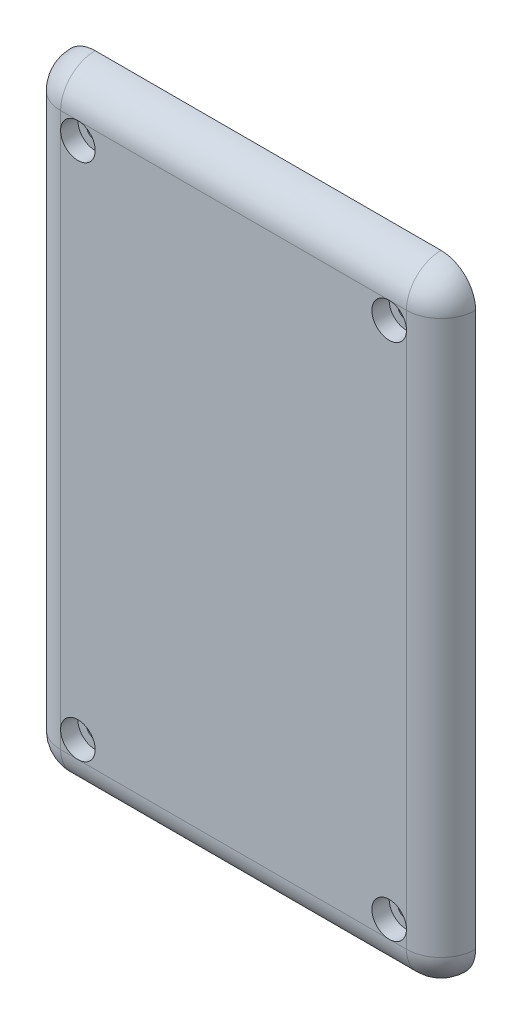
ISO-10303-21;
HEADER;
FILE_DESCRIPTION(('STEP AP214'),'2;1');
FILE_NAME('part.step','',(''),(''),'','','');
FILE_SCHEMA(('AUTOMOTIVE_DESIGN { 1 0 10303 214 1 1 1 1 }'));
ENDSEC;
DATA;
#1=APPLICATION_CONTEXT('core data for automotive mechanical design processes');
#2=APPLICATION_PROTOCOL_DEFINITION('international standard','automotive_design',2000,#1);
#3=PRODUCT_CONTEXT('',#1,'mechanical');
#4=PRODUCT('Part','Part','',(#3));
#5=PRODUCT_RELATED_PRODUCT_CATEGORY('part','',(#4));
#6=PRODUCT_DEFINITION_FORMATION('','',#4);
#7=PRODUCT_DEFINITION_CONTEXT('part definition',#1,'design');
#8=PRODUCT_DEFINITION('design','',#6,#7);
#9=PRODUCT_DEFINITION_SHAPE('','',#8);
#10=(LENGTH_UNIT() NAMED_UNIT(*) SI_UNIT(.MILLI.,.METRE.));
#11=(NAMED_UNIT(*) PLANE_ANGLE_UNIT() SI_UNIT($,.RADIAN.));
#12=(NAMED_UNIT(*) SI_UNIT($,.STERADIAN.) SOLID_ANGLE_UNIT());
#13=UNCERTAINTY_MEASURE_WITH_UNIT(LENGTH_MEASURE(1.E-05),#10,'distance_accuracy_value','');
#14=(GEOMETRIC_REPRESENTATION_CONTEXT(3) GLOBAL_UNCERTAINTY_ASSIGNED_CONTEXT((#13)) GLOBAL_UNIT_ASSIGNED_CONTEXT((#10,
#11,#12)) REPRESENTATION_CONTEXT('',''));
#15=CARTESIAN_POINT('',(0.,0.,0.));
#16=DIRECTION('',(0.,0.,1.));
#17=DIRECTION('',(1.,0.,0.));
#18=AXIS2_PLACEMENT_3D('',#15,#16,#17);
#19=CARTESIAN_POINT('',(0.,0.,2.));
#20=DIRECTION('',(0.,0.,-1.));
#21=DIRECTION('',(-1.,0.,0.));
#22=AXIS2_PLACEMENT_3D('',#19,#20,#21);
#23=PLANE('',#22);
#24=DIRECTION('',(0.,-1.,0.));
#25=VECTOR('',#24,1.);
#26=CARTESIAN_POINT('',(-119.790086771129,0.,2.));
#27=LINE('',#26,#25);
#28=CARTESIAN_POINT('',(-119.790086771129,75.7285838497429,2.));
#29=VERTEX_POINT('',#28);
#30=CARTESIAN_POINT('',(-119.790086771129,74.7285838497429,2.));
#31=VERTEX_POINT('',#30);
#32=EDGE_CURVE('E11',#29,#31,#27,.T.);
#33=ORIENTED_EDGE('',*,*,#32,.T.);
#34=CARTESIAN_POINT('',(-118.790086771129,74.7285838497429,2.));
#35=DIRECTION('',(0.,0.,1.));
#36=DIRECTION('',(1.,0.,0.));
#37=AXIS2_PLACEMENT_3D('',#34,#35,#36);
#38=CIRCLE('',#37,0.999999999999998);
#39=CARTESIAN_POINT('',(-118.790086771129,75.7285838497429,2.));
#40=VERTEX_POINT('',#39);
#41=EDGE_CURVE('E204',#40,#31,#38,.T.);
#42=ORIENTED_EDGE('',*,*,#41,.F.);
#43=DIRECTION('',(-1.,0.,0.));
#44=VECTOR('',#43,1.);
#45=CARTESIAN_POINT('',(0.,75.7285838497429,2.));
#46=LINE('',#45,#44);
#47=EDGE_CURVE('E162',#40,#29,#46,.T.);
#48=ORIENTED_EDGE('',*,*,#47,.T.);
#49=EDGE_LOOP('',(#33,#42,#48));
#50=FACE_BOUND('',#49,.T.);
#51=ADVANCED_FACE('F38',(#50),#23,.F.);
#52=CARTESIAN_POINT('',(-100.790086771129,75.7285838497429,2.));
#53=VERTEX_POINT('',#52);
#54=EDGE_CURVE('E161',#53,#40,#46,.T.);
#55=ORIENTED_EDGE('',*,*,#54,.T.);
#56=EDGE_CURVE('E206',#31,#40,#38,.T.);
#57=ORIENTED_EDGE('',*,*,#56,.F.);
#58=CARTESIAN_POINT('',(-119.790086771129,44.728583849743,2.));
#59=VERTEX_POINT('',#58);
#60=EDGE_CURVE('E47',#31,#59,#27,.T.);
#61=ORIENTED_EDGE('',*,*,#60,.T.);
#62=CARTESIAN_POINT('',(-118.790086771129,44.728583849743,2.));
#63=DIRECTION('',(0.,0.,1.));
#64=DIRECTION('',(1.,0.,0.));
#65=AXIS2_PLACEMENT_3D('',#62,#63,#64);
#66=CIRCLE('',#65,0.999999999999998);
#67=CARTESIAN_POINT('',(-118.790086771129,43.728583849743,2.));
#68=VERTEX_POINT('',#67);
#69=EDGE_CURVE('E120',#68,#59,#66,.T.);
#70=ORIENTED_EDGE('',*,*,#69,.F.);
#71=DIRECTION('',(1.,0.,0.));
#72=VECTOR('',#71,1.);
#73=CARTESIAN_POINT('',(0.,43.728583849743,2.));
#74=LINE('',#73,#72);
#75=CARTESIAN_POINT('',(-100.790086771129,43.728583849743,2.));
#76=VERTEX_POINT('',#75);
#77=EDGE_CURVE('E132',#68,#76,#74,.T.);
#78=ORIENTED_EDGE('',*,*,#77,.T.);
#79=CARTESIAN_POINT('',(-100.790086771129,44.728583849743,2.));
#80=DIRECTION('',(0.,0.,1.));
#81=DIRECTION('',(1.,0.,0.));
#82=AXIS2_PLACEMENT_3D('',#79,#80,#81);
#83=CIRCLE('',#82,0.999999999999998);
#84=CARTESIAN_POINT('',(-99.7900867711287,44.728583849743,2.));
#85=VERTEX_POINT('',#84);
#86=EDGE_CURVE('E211',#85,#76,#83,.T.);
#87=ORIENTED_EDGE('',*,*,#86,.F.);
#88=DIRECTION('',(0.,1.,0.));
#89=VECTOR('',#88,1.);
#90=CARTESIAN_POINT('',(-99.7900867711287,0.,2.));
#91=LINE('',#90,#89);
#92=CARTESIAN_POINT('',(-99.7900867711287,74.7285838497429,2.));
#93=VERTEX_POINT('',#92);
#94=EDGE_CURVE('E151',#85,#93,#91,.T.);
#95=ORIENTED_EDGE('',*,*,#94,.T.);
#96=CARTESIAN_POINT('',(-100.790086771129,74.7285838497429,2.));
#97=DIRECTION('',(0.,0.,1.));
#98=DIRECTION('',(1.,0.,0.));
#99=AXIS2_PLACEMENT_3D('',#96,#97,#98);
#100=CIRCLE('',#99,0.999999999999998);
#101=EDGE_CURVE('E201',#53,#93,#100,.T.);
#102=ORIENTED_EDGE('',*,*,#101,.F.);
#103=EDGE_LOOP('',(#55,#57,#61,#70,#78,#87,#95,#102));
#104=FACE_BOUND('',#103,.T.);
#105=ADVANCED_FACE('F131',(#104),#23,.F.);
#106=CARTESIAN_POINT('',(-99.7900867711287,43.728583849743,2.));
#107=VERTEX_POINT('',#106);
#108=EDGE_CURVE('E148',#107,#85,#91,.T.);
#109=ORIENTED_EDGE('',*,*,#108,.T.);
#110=EDGE_CURVE('E55',#76,#85,#83,.T.);
#111=ORIENTED_EDGE('',*,*,#110,.F.);
#112=EDGE_CURVE('E143',#76,#107,#74,.T.);
#113=ORIENTED_EDGE('',*,*,#112,.T.);
#114=EDGE_LOOP('',(#109,#111,#113));
#115=FACE_BOUND('',#114,.T.);
#116=ADVANCED_FACE('F254',(#115),#23,.F.);
#117=CARTESIAN_POINT('',(-99.7900867711287,75.7285838497429,2.));
#118=VERTEX_POINT('',#117);
#119=EDGE_CURVE('E156',#118,#53,#46,.T.);
#120=ORIENTED_EDGE('',*,*,#119,.T.);
#121=EDGE_CURVE('E62',#93,#53,#100,.T.);
#122=ORIENTED_EDGE('',*,*,#121,.F.);
#123=EDGE_CURVE('E152',#93,#118,#91,.T.);
#124=ORIENTED_EDGE('',*,*,#123,.T.);
#125=EDGE_LOOP('',(#120,#122,#124));
#126=FACE_BOUND('',#125,.T.);
#127=ADVANCED_FACE('F256',(#126),#23,.F.);
#128=CARTESIAN_POINT('',(-119.790086771129,43.728583849743,2.));
#129=VERTEX_POINT('',#128);
#130=EDGE_CURVE('E142',#129,#68,#74,.T.);
#131=ORIENTED_EDGE('',*,*,#130,.T.);
#132=EDGE_CURVE('E117',#59,#68,#66,.T.);
#133=ORIENTED_EDGE('',*,*,#132,.F.);
#134=EDGE_CURVE('E49',#59,#129,#27,.T.);
#135=ORIENTED_EDGE('',*,*,#134,.T.);
#136=EDGE_LOOP('',(#131,#133,#135));
#137=FACE_BOUND('',#136,.T.);
#138=ADVANCED_FACE('F145',(#137),#23,.F.);
#139=CARTESIAN_POINT('',(0.,0.,0.));
#140=DIRECTION('',(0.,0.,-1.));
#141=DIRECTION('',(-1.,0.,0.));
#142=AXIS2_PLACEMENT_3D('',#139,#140,#141);
#143=PLANE('',#142);
#144=CARTESIAN_POINT('',(-118.790086771129,74.7285838497429,0.));
#145=DIRECTION('',(0.,0.,-1.));
#146=DIRECTION('',(-1.,0.,0.));
#147=AXIS2_PLACEMENT_3D('',#144,#145,#146);
#148=CIRCLE('',#147,0.499999999999999);
#149=CARTESIAN_POINT('',(-119.290086771129,74.7285838497429,0.));
#150=VERTEX_POINT('',#149);
#151=EDGE_CURVE('E223',#150,#150,#148,.F.);
#152=ORIENTED_EDGE('',*,*,#151,.T.);
#153=EDGE_LOOP('',(#152));
#154=FACE_BOUND('',#153,.T.);
#155=CARTESIAN_POINT('',(-100.790086771129,74.7285838497429,0.));
#156=DIRECTION('',(0.,0.,-1.));
#157=DIRECTION('',(-1.,0.,0.));
#158=AXIS2_PLACEMENT_3D('',#155,#156,#157);
#159=CIRCLE('',#158,0.499999999999999);
#160=CARTESIAN_POINT('',(-101.290086771129,74.7285838497429,0.));
#161=VERTEX_POINT('',#160);
#162=EDGE_CURVE('E229',#161,#161,#159,.F.);
#163=ORIENTED_EDGE('',*,*,#162,.T.);
#164=EDGE_LOOP('',(#163));
#165=FACE_BOUND('',#164,.T.);
#166=CARTESIAN_POINT('',(-100.790086771129,44.728583849743,0.));
#167=DIRECTION('',(0.,0.,-1.));
#168=DIRECTION('',(-1.,0.,0.));
#169=AXIS2_PLACEMENT_3D('',#166,#167,#168);
#170=CIRCLE('',#169,0.499999999999999);
#171=CARTESIAN_POINT('',(-101.290086771129,44.728583849743,0.));
#172=VERTEX_POINT('',#171);
#173=EDGE_CURVE('E235',#172,#172,#170,.F.);
#174=ORIENTED_EDGE('',*,*,#173,.T.);
#175=EDGE_LOOP('',(#174));
#176=FACE_BOUND('',#175,.T.);
#177=CARTESIAN_POINT('',(-118.790086771129,44.728583849743,0.));
#178=DIRECTION('',(0.,0.,-1.));
#179=DIRECTION('',(-1.,0.,0.));
#180=AXIS2_PLACEMENT_3D('',#177,#178,#179);
#181=CIRCLE('',#180,0.499999999999999);
#182=CARTESIAN_POINT('',(-119.290086771129,44.728583849743,0.));
#183=VERTEX_POINT('',#182);
#184=EDGE_CURVE('E216',#183,#183,#181,.F.);
#185=ORIENTED_EDGE('',*,*,#184,.T.);
#186=EDGE_LOOP('',(#185));
#187=FACE_BOUND('',#186,.T.);
#188=CARTESIAN_POINT('',(-117.950086771129,65.9785838497429,0.));
#189=DIRECTION('',(0.,0.,-1.));
#190=DIRECTION('',(-1.,0.,0.));
#191=AXIS2_PLACEMENT_3D('',#188,#189,#190);
#192=CIRCLE('',#191,2.04999999999999);
#193=CARTESIAN_POINT('',(-120.000086771129,65.9785838497429,0.));
#194=VERTEX_POINT('',#193);
#195=EDGE_CURVE('E192',#194,#194,#192,.T.);
#196=ORIENTED_EDGE('',*,*,#195,.F.);
#197=EDGE_LOOP('',(#196));
#198=FACE_BOUND('',#197,.T.);
#199=DIRECTION('',(0.,-1.,0.));
#200=VECTOR('',#199,1.);
#201=CARTESIAN_POINT('',(-121.790086771129,77.7285838497429,0.));
#202=LINE('',#201,#200);
#203=CARTESIAN_POINT('',(-121.790086771129,75.7285838497429,0.));
#204=VERTEX_POINT('',#203);
#205=CARTESIAN_POINT('',(-121.790086771129,43.728583849743,0.));
#206=VERTEX_POINT('',#205);
#207=EDGE_CURVE('E183',#204,#206,#202,.T.);
#208=ORIENTED_EDGE('',*,*,#207,.F.);
#209=CARTESIAN_POINT('',(-119.790086771129,75.7285838497429,0.));
#210=DIRECTION('',(0.,0.,-1.));
#211=DIRECTION('',(-1.,0.,0.));
#212=AXIS2_PLACEMENT_3D('',#209,#210,#211);
#213=CIRCLE('',#212,2.);
#214=CARTESIAN_POINT('',(-119.790086771129,77.7285838497429,0.));
#215=VERTEX_POINT('',#214);
#216=EDGE_CURVE('E165',#204,#215,#213,.T.);
#217=ORIENTED_EDGE('',*,*,#216,.T.);
#218=DIRECTION('',(-1.,0.,0.));
#219=VECTOR('',#218,1.);
#220=CARTESIAN_POINT('',(-97.7900867711287,77.7285838497429,0.));
#221=LINE('',#220,#219);
#222=CARTESIAN_POINT('',(-99.7900867711287,77.7285838497429,0.));
#223=VERTEX_POINT('',#222);
#224=EDGE_CURVE('E186',#223,#215,#221,.T.);
#225=ORIENTED_EDGE('',*,*,#224,.F.);
#226=CARTESIAN_POINT('',(-99.7900867711287,75.7285838497429,0.));
#227=DIRECTION('',(0.,0.,-1.));
#228=DIRECTION('',(-1.,0.,0.));
#229=AXIS2_PLACEMENT_3D('',#226,#227,#228);
#230=CIRCLE('',#229,2.);
#231=CARTESIAN_POINT('',(-97.7900867711287,75.7285838497429,0.));
#232=VERTEX_POINT('',#231);
#233=EDGE_CURVE('E178',#223,#232,#230,.T.);
#234=ORIENTED_EDGE('',*,*,#233,.T.);
#235=DIRECTION('',(0.,1.,0.));
#236=VECTOR('',#235,1.);
#237=CARTESIAN_POINT('',(-97.7900867711287,77.7285838497429,0.));
#238=LINE('',#237,#236);
#239=CARTESIAN_POINT('',(-97.7900867711287,43.728583849743,0.));
#240=VERTEX_POINT('',#239);
#241=EDGE_CURVE('E189',#240,#232,#238,.T.);
#242=ORIENTED_EDGE('',*,*,#241,.F.);
#243=CARTESIAN_POINT('',(-99.7900867711287,43.728583849743,0.));
#244=DIRECTION('',(0.,0.,-1.));
#245=DIRECTION('',(-1.,0.,0.));
#246=AXIS2_PLACEMENT_3D('',#243,#244,#245);
#247=CIRCLE('',#246,2.);
#248=CARTESIAN_POINT('',(-99.7900867711287,41.7285838497429,0.));
#249=VERTEX_POINT('',#248);
#250=EDGE_CURVE('E174',#240,#249,#247,.T.);
#251=ORIENTED_EDGE('',*,*,#250,.T.);
#252=DIRECTION('',(1.,0.,0.));
#253=VECTOR('',#252,1.);
#254=CARTESIAN_POINT('',(-97.7900867711287,41.7285838497429,0.));
#255=LINE('',#254,#253);
#256=CARTESIAN_POINT('',(-119.790086771129,41.7285838497429,0.));
#257=VERTEX_POINT('',#256);
#258=EDGE_CURVE('E180',#257,#249,#255,.T.);
#259=ORIENTED_EDGE('',*,*,#258,.F.);
#260=CARTESIAN_POINT('',(-119.790086771129,43.728583849743,0.));
#261=DIRECTION('',(0.,0.,-1.));
#262=DIRECTION('',(-1.,0.,0.));
#263=AXIS2_PLACEMENT_3D('',#260,#261,#262);
#264=CIRCLE('',#263,2.);
#265=EDGE_CURVE('E171',#257,#206,#264,.T.);
#266=ORIENTED_EDGE('',*,*,#265,.T.);
#267=EDGE_LOOP('',(#208,#217,#225,#234,#242,#251,#259,#266));
#268=FACE_BOUND('',#267,.T.);
#269=ADVANCED_FACE('F268',(#154,#165,#176,#187,#198,#268),#143,.T.);
#270=CARTESIAN_POINT('',(-99.7900867711287,43.728583849743,0.));
#271=DIRECTION('',(1.,0.,0.));
#272=DIRECTION('',(0.,0.,-1.));
#273=AXIS2_PLACEMENT_3D('',#270,#271,#272);
#274=SPHERICAL_SURFACE('',#273,2.);
#275=CARTESIAN_POINT('',(-99.7900867711287,43.728583849743,0.));
#276=DIRECTION('',(1.,0.,0.));
#277=DIRECTION('',(0.,0.,-1.));
#278=AXIS2_PLACEMENT_3D('',#275,#276,#277);
#279=CIRCLE('',#278,2.);
#280=EDGE_CURVE('E311',#249,#107,#279,.F.);
#281=ORIENTED_EDGE('',*,*,#280,.F.);
#282=ORIENTED_EDGE('',*,*,#250,.F.);
#283=CARTESIAN_POINT('',(-99.7900867711287,43.728583849743,0.));
#284=DIRECTION('',(0.,-1.,0.));
#285=DIRECTION('',(0.,0.,-1.));
#286=AXIS2_PLACEMENT_3D('',#283,#284,#285);
#287=CIRCLE('',#286,2.);
#288=EDGE_CURVE('E42',#107,#240,#287,.F.);
#289=ORIENTED_EDGE('',*,*,#288,.F.);
#290=EDGE_LOOP('',(#281,#282,#289));
#291=FACE_BOUND('',#290,.T.);
#292=ADVANCED_FACE('F40',(#291),#274,.T.);
#293=CARTESIAN_POINT('',(-99.7900867711287,0.,0.));
#294=DIRECTION('',(0.,1.,0.));
#295=DIRECTION('',(-1.,0.,0.));
#296=AXIS2_PLACEMENT_3D('',#293,#294,#295);
#297=CYLINDRICAL_SURFACE('',#296,2.);
#298=ORIENTED_EDGE('',*,*,#288,.T.);
#299=ORIENTED_EDGE('',*,*,#241,.T.);
#300=CARTESIAN_POINT('',(-99.7900867711287,75.7285838497429,0.));
#301=DIRECTION('',(0.,1.,0.));
#302=DIRECTION('',(0.,0.,1.));
#303=AXIS2_PLACEMENT_3D('',#300,#301,#302);
#304=CIRCLE('',#303,2.);
#305=EDGE_CURVE('E312',#118,#232,#304,.T.);
#306=ORIENTED_EDGE('',*,*,#305,.F.);
#307=ORIENTED_EDGE('',*,*,#123,.F.);
#308=ORIENTED_EDGE('',*,*,#94,.F.);
#309=ORIENTED_EDGE('',*,*,#108,.F.);
#310=EDGE_LOOP('',(#298,#299,#306,#307,#308,#309));
#311=FACE_BOUND('',#310,.T.);
#312=ADVANCED_FACE('F276',(#311),#297,.T.);
#313=CARTESIAN_POINT('',(0.,43.728583849743,0.));
#314=DIRECTION('',(1.,0.,0.));
#315=DIRECTION('',(0.,0.,-1.));
#316=AXIS2_PLACEMENT_3D('',#313,#314,#315);
#317=CYLINDRICAL_SURFACE('',#316,2.);
#318=ORIENTED_EDGE('',*,*,#280,.T.);
#319=ORIENTED_EDGE('',*,*,#112,.F.);
#320=ORIENTED_EDGE('',*,*,#77,.F.);
#321=ORIENTED_EDGE('',*,*,#130,.F.);
#322=CARTESIAN_POINT('',(-119.790086771129,43.728583849743,0.));
#323=DIRECTION('',(-1.,0.,0.));
#324=DIRECTION('',(0.,0.,1.));
#325=AXIS2_PLACEMENT_3D('',#322,#323,#324);
#326=CIRCLE('',#325,2.);
#327=EDGE_CURVE('E313',#257,#129,#326,.T.);
#328=ORIENTED_EDGE('',*,*,#327,.F.);
#329=ORIENTED_EDGE('',*,*,#258,.T.);
#330=EDGE_LOOP('',(#318,#319,#320,#321,#328,#329));
#331=FACE_BOUND('',#330,.T.);
#332=ADVANCED_FACE('F140',(#331),#317,.T.);
#333=CARTESIAN_POINT('',(-99.7900867711287,75.7285838497429,0.));
#334=DIRECTION('',(1.,0.,0.));
#335=DIRECTION('',(0.,0.,-1.));
#336=AXIS2_PLACEMENT_3D('',#333,#334,#335);
#337=SPHERICAL_SURFACE('',#336,2.);
#338=ORIENTED_EDGE('',*,*,#305,.T.);
#339=ORIENTED_EDGE('',*,*,#233,.F.);
#340=CARTESIAN_POINT('',(-99.7900867711287,75.7285838497429,0.));
#341=DIRECTION('',(1.,0.,0.));
#342=DIRECTION('',(0.,0.,-1.));
#343=AXIS2_PLACEMENT_3D('',#340,#341,#342);
#344=CIRCLE('',#343,2.);
#345=EDGE_CURVE('E318',#118,#223,#344,.F.);
#346=ORIENTED_EDGE('',*,*,#345,.F.);
#347=EDGE_LOOP('',(#338,#339,#346));
#348=FACE_BOUND('',#347,.T.);
#349=ADVANCED_FACE('F296',(#348),#337,.T.);
#350=CARTESIAN_POINT('',(-119.790086771129,43.728583849743,0.));
#351=DIRECTION('',(0.,-1.,0.));
#352=DIRECTION('',(0.,0.,-1.));
#353=AXIS2_PLACEMENT_3D('',#350,#351,#352);
#354=SPHERICAL_SURFACE('',#353,2.);
#355=ORIENTED_EDGE('',*,*,#265,.F.);
#356=ORIENTED_EDGE('',*,*,#327,.T.);
#357=CARTESIAN_POINT('',(-119.790086771129,43.728583849743,0.));
#358=DIRECTION('',(0.,-1.,0.));
#359=DIRECTION('',(0.,0.,-1.));
#360=AXIS2_PLACEMENT_3D('',#357,#358,#359);
#361=CIRCLE('',#360,2.);
#362=EDGE_CURVE('E321',#206,#129,#361,.F.);
#363=ORIENTED_EDGE('',*,*,#362,.F.);
#364=EDGE_LOOP('',(#355,#356,#363));
#365=FACE_BOUND('',#364,.T.);
#366=ADVANCED_FACE('F292',(#365),#354,.T.);
#367=CARTESIAN_POINT('',(0.,75.7285838497429,0.));
#368=DIRECTION('',(-1.,0.,0.));
#369=DIRECTION('',(0.,0.,1.));
#370=AXIS2_PLACEMENT_3D('',#367,#368,#369);
#371=CYLINDRICAL_SURFACE('',#370,2.);
#372=ORIENTED_EDGE('',*,*,#345,.T.);
#373=ORIENTED_EDGE('',*,*,#224,.T.);
#374=CARTESIAN_POINT('',(-119.790086771129,75.7285838497429,0.));
#375=DIRECTION('',(-1.,0.,0.));
#376=DIRECTION('',(0.,0.,1.));
#377=AXIS2_PLACEMENT_3D('',#374,#375,#376);
#378=CIRCLE('',#377,2.);
#379=EDGE_CURVE('E323',#29,#215,#378,.T.);
#380=ORIENTED_EDGE('',*,*,#379,.F.);
#381=ORIENTED_EDGE('',*,*,#47,.F.);
#382=ORIENTED_EDGE('',*,*,#54,.F.);
#383=ORIENTED_EDGE('',*,*,#119,.F.);
#384=EDGE_LOOP('',(#372,#373,#380,#381,#382,#383));
#385=FACE_BOUND('',#384,.T.);
#386=ADVANCED_FACE('F288',(#385),#371,.T.);
#387=CARTESIAN_POINT('',(-119.790086771129,0.,0.));
#388=DIRECTION('',(0.,-1.,0.));
#389=DIRECTION('',(0.,0.,-1.));
#390=AXIS2_PLACEMENT_3D('',#387,#388,#389);
#391=CYLINDRICAL_SURFACE('',#390,2.);
#392=ORIENTED_EDGE('',*,*,#362,.T.);
#393=ORIENTED_EDGE('',*,*,#134,.F.);
#394=ORIENTED_EDGE('',*,*,#60,.F.);
#395=ORIENTED_EDGE('',*,*,#32,.F.);
#396=CARTESIAN_POINT('',(-119.790086771129,75.7285838497429,0.));
#397=DIRECTION('',(0.,1.,0.));
#398=DIRECTION('',(0.,0.,1.));
#399=AXIS2_PLACEMENT_3D('',#396,#397,#398);
#400=CIRCLE('',#399,2.);
#401=EDGE_CURVE('E199',#204,#29,#400,.T.);
#402=ORIENTED_EDGE('',*,*,#401,.F.);
#403=ORIENTED_EDGE('',*,*,#207,.T.);
#404=EDGE_LOOP('',(#392,#393,#394,#395,#402,#403));
#405=FACE_BOUND('',#404,.T.);
#406=ADVANCED_FACE('F284',(#405),#391,.T.);
#407=CARTESIAN_POINT('',(-119.790086771129,75.7285838497429,0.));
#408=DIRECTION('',(0.,0.,1.));
#409=DIRECTION('',(1.,0.,0.));
#410=AXIS2_PLACEMENT_3D('',#407,#408,#409);
#411=SPHERICAL_SURFACE('',#410,2.);
#412=ORIENTED_EDGE('',*,*,#216,.F.);
#413=ORIENTED_EDGE('',*,*,#401,.T.);
#414=ORIENTED_EDGE('',*,*,#379,.T.);
#415=EDGE_LOOP('',(#412,#413,#414));
#416=FACE_BOUND('',#415,.T.);
#417=ADVANCED_FACE('F280',(#416),#411,.T.);
#418=CARTESIAN_POINT('',(-117.950086771129,65.9785838497429,1.));
#419=DIRECTION('',(0.,0.,-1.));
#420=DIRECTION('',(-1.,0.,0.));
#421=AXIS2_PLACEMENT_3D('',#418,#419,#420);
#422=CYLINDRICAL_SURFACE('',#421,2.04999999999999);
#423=CARTESIAN_POINT('',(-117.950086771129,65.9785838497429,1.));
#424=DIRECTION('',(0.,0.,-1.));
#425=DIRECTION('',(-1.,0.,0.));
#426=AXIS2_PLACEMENT_3D('',#423,#424,#425);
#427=CIRCLE('',#426,2.04999999999999);
#428=CARTESIAN_POINT('',(-120.000086771129,65.9785838497429,1.));
#429=VERTEX_POINT('',#428);
#430=EDGE_CURVE('E195',#429,#429,#427,.T.);
#431=ORIENTED_EDGE('',*,*,#430,.F.);
#432=EDGE_LOOP('',(#431));
#433=FACE_BOUND('',#432,.T.);
#434=ORIENTED_EDGE('',*,*,#195,.T.);
#435=EDGE_LOOP('',(#434));
#436=FACE_BOUND('',#435,.T.);
#437=ADVANCED_FACE('F283',(#433,#436),#422,.F.);
#438=CARTESIAN_POINT('',(-117.950086771129,65.9785838497429,1.));
#439=DIRECTION('',(0.,0.,-1.));
#440=DIRECTION('',(-1.,0.,0.));
#441=AXIS2_PLACEMENT_3D('',#438,#439,#440);
#442=PLANE('',#441);
#443=ORIENTED_EDGE('',*,*,#430,.T.);
#444=EDGE_LOOP('',(#443));
#445=FACE_BOUND('',#444,.T.);
#446=ADVANCED_FACE('F333',(#445),#442,.T.);
#447=CARTESIAN_POINT('',(-100.790086771129,74.7285838497429,1.));
#448=DIRECTION('',(0.,0.,1.));
#449=DIRECTION('',(1.,0.,0.));
#450=AXIS2_PLACEMENT_3D('',#447,#448,#449);
#451=CYLINDRICAL_SURFACE('',#450,0.999999999999998);
#452=CARTESIAN_POINT('',(-100.790086771129,74.7285838497429,1.));
#453=DIRECTION('',(0.,0.,1.));
#454=DIRECTION('',(1.,0.,0.));
#455=AXIS2_PLACEMENT_3D('',#452,#453,#454);
#456=CIRCLE('',#455,0.999999999999998);
#457=CARTESIAN_POINT('',(-99.7900867711287,74.7285838497429,1.));
#458=VERTEX_POINT('',#457);
#459=EDGE_CURVE('E196',#458,#458,#456,.T.);
#460=ORIENTED_EDGE('',*,*,#459,.F.);
#461=EDGE_LOOP('',(#460));
#462=FACE_BOUND('',#461,.T.);
#463=ORIENTED_EDGE('',*,*,#121,.T.);
#464=ORIENTED_EDGE('',*,*,#101,.T.);
#465=EDGE_LOOP('',(#463,#464));
#466=FACE_BOUND('',#465,.T.);
#467=ADVANCED_FACE('F331',(#462,#466),#451,.F.);
#468=CARTESIAN_POINT('',(-100.790086771129,74.7285838497429,1.));
#469=DIRECTION('',(0.,0.,1.));
#470=DIRECTION('',(1.,0.,0.));
#471=AXIS2_PLACEMENT_3D('',#468,#469,#470);
#472=PLANE('',#471);
#473=CARTESIAN_POINT('',(-100.790086771129,74.7285838497429,1.));
#474=DIRECTION('',(0.,0.,1.));
#475=DIRECTION('',(1.,0.,0.));
#476=AXIS2_PLACEMENT_3D('',#473,#474,#475);
#477=CIRCLE('',#476,0.499999999999999);
#478=CARTESIAN_POINT('',(-100.290086771129,74.7285838497429,1.));
#479=VERTEX_POINT('',#478);
#480=EDGE_CURVE('E232',#479,#479,#477,.T.);
#481=ORIENTED_EDGE('',*,*,#480,.F.);
#482=EDGE_LOOP('',(#481));
#483=FACE_BOUND('',#482,.T.);
#484=ORIENTED_EDGE('',*,*,#459,.T.);
#485=EDGE_LOOP('',(#484));
#486=FACE_BOUND('',#485,.T.);
#487=ADVANCED_FACE('F251',(#483,#486),#472,.T.);
#488=CARTESIAN_POINT('',(-100.790086771129,44.728583849743,1.));
#489=DIRECTION('',(0.,0.,1.));
#490=DIRECTION('',(1.,0.,0.));
#491=AXIS2_PLACEMENT_3D('',#488,#489,#490);
#492=CYLINDRICAL_SURFACE('',#491,0.999999999999998);
#493=CARTESIAN_POINT('',(-100.790086771129,44.728583849743,1.));
#494=DIRECTION('',(0.,0.,1.));
#495=DIRECTION('',(1.,0.,0.));
#496=AXIS2_PLACEMENT_3D('',#493,#494,#495);
#497=CIRCLE('',#496,0.999999999999998);
#498=CARTESIAN_POINT('',(-99.7900867711287,44.728583849743,1.));
#499=VERTEX_POINT('',#498);
#500=EDGE_CURVE('E213',#499,#499,#497,.T.);
#501=ORIENTED_EDGE('',*,*,#500,.F.);
#502=EDGE_LOOP('',(#501));
#503=FACE_BOUND('',#502,.T.);
#504=ORIENTED_EDGE('',*,*,#86,.T.);
#505=ORIENTED_EDGE('',*,*,#110,.T.);
#506=EDGE_LOOP('',(#504,#505));
#507=FACE_BOUND('',#506,.T.);
#508=ADVANCED_FACE('F246',(#503,#507),#492,.F.);
#509=CARTESIAN_POINT('',(-100.790086771129,44.728583849743,1.));
#510=DIRECTION('',(0.,0.,1.));
#511=DIRECTION('',(1.,0.,0.));
#512=AXIS2_PLACEMENT_3D('',#509,#510,#511);
#513=PLANE('',#512);
#514=CARTESIAN_POINT('',(-100.790086771129,44.728583849743,1.));
#515=DIRECTION('',(0.,0.,1.));
#516=DIRECTION('',(1.,0.,0.));
#517=AXIS2_PLACEMENT_3D('',#514,#515,#516);
#518=CIRCLE('',#517,0.499999999999999);
#519=CARTESIAN_POINT('',(-100.290086771129,44.728583849743,1.));
#520=VERTEX_POINT('',#519);
#521=EDGE_CURVE('E220',#520,#520,#518,.T.);
#522=ORIENTED_EDGE('',*,*,#521,.F.);
#523=EDGE_LOOP('',(#522));
#524=FACE_BOUND('',#523,.T.);
#525=ORIENTED_EDGE('',*,*,#500,.T.);
#526=EDGE_LOOP('',(#525));
#527=FACE_BOUND('',#526,.T.);
#528=ADVANCED_FACE('F243',(#524,#527),#513,.T.);
#529=CARTESIAN_POINT('',(-118.790086771129,44.728583849743,1.));
#530=DIRECTION('',(0.,0.,1.));
#531=DIRECTION('',(1.,0.,0.));
#532=AXIS2_PLACEMENT_3D('',#529,#530,#531);
#533=CYLINDRICAL_SURFACE('',#532,0.999999999999998);
#534=CARTESIAN_POINT('',(-118.790086771129,44.728583849743,1.));
#535=DIRECTION('',(0.,0.,1.));
#536=DIRECTION('',(1.,0.,0.));
#537=AXIS2_PLACEMENT_3D('',#534,#535,#536);
#538=CIRCLE('',#537,0.999999999999998);
#539=CARTESIAN_POINT('',(-117.790086771129,44.728583849743,1.));
#540=VERTEX_POINT('',#539);
#541=EDGE_CURVE('E124',#540,#540,#538,.T.);
#542=ORIENTED_EDGE('',*,*,#541,.F.);
#543=EDGE_LOOP('',(#542));
#544=FACE_BOUND('',#543,.T.);
#545=ORIENTED_EDGE('',*,*,#132,.T.);
#546=ORIENTED_EDGE('',*,*,#69,.T.);
#547=EDGE_LOOP('',(#545,#546));
#548=FACE_BOUND('',#547,.T.);
#549=ADVANCED_FACE('F119',(#544,#548),#533,.F.);
#550=CARTESIAN_POINT('',(-118.790086771129,44.728583849743,1.));
#551=DIRECTION('',(0.,0.,1.));
#552=DIRECTION('',(1.,0.,0.));
#553=AXIS2_PLACEMENT_3D('',#550,#551,#552);
#554=PLANE('',#553);
#555=CARTESIAN_POINT('',(-118.790086771129,44.728583849743,1.));
#556=DIRECTION('',(0.,0.,1.));
#557=DIRECTION('',(1.,0.,0.));
#558=AXIS2_PLACEMENT_3D('',#555,#556,#557);
#559=CIRCLE('',#558,0.499999999999999);
#560=CARTESIAN_POINT('',(-118.290086771129,44.728583849743,1.));
#561=VERTEX_POINT('',#560);
#562=EDGE_CURVE('E219',#561,#561,#559,.T.);
#563=ORIENTED_EDGE('',*,*,#562,.F.);
#564=EDGE_LOOP('',(#563));
#565=FACE_BOUND('',#564,.T.);
#566=ORIENTED_EDGE('',*,*,#541,.T.);
#567=EDGE_LOOP('',(#566));
#568=FACE_BOUND('',#567,.T.);
#569=ADVANCED_FACE('F432',(#565,#568),#554,.T.);
#570=CARTESIAN_POINT('',(-118.790086771129,74.7285838497429,1.));
#571=DIRECTION('',(0.,0.,1.));
#572=DIRECTION('',(1.,0.,0.));
#573=AXIS2_PLACEMENT_3D('',#570,#571,#572);
#574=CYLINDRICAL_SURFACE('',#573,0.999999999999998);
#575=CARTESIAN_POINT('',(-118.790086771129,74.7285838497429,1.));
#576=DIRECTION('',(0.,0.,1.));
#577=DIRECTION('',(1.,0.,0.));
#578=AXIS2_PLACEMENT_3D('',#575,#576,#577);
#579=CIRCLE('',#578,0.999999999999998);
#580=CARTESIAN_POINT('',(-117.790086771129,74.7285838497429,1.));
#581=VERTEX_POINT('',#580);
#582=EDGE_CURVE('E135',#581,#581,#579,.T.);
#583=ORIENTED_EDGE('',*,*,#582,.F.);
#584=EDGE_LOOP('',(#583));
#585=FACE_BOUND('',#584,.T.);
#586=ORIENTED_EDGE('',*,*,#41,.T.);
#587=ORIENTED_EDGE('',*,*,#56,.T.);
#588=EDGE_LOOP('',(#586,#587));
#589=FACE_BOUND('',#588,.T.);
#590=ADVANCED_FACE('F440',(#585,#589),#574,.F.);
#591=CARTESIAN_POINT('',(-118.790086771129,74.7285838497429,1.));
#592=DIRECTION('',(0.,0.,1.));
#593=DIRECTION('',(1.,0.,0.));
#594=AXIS2_PLACEMENT_3D('',#591,#592,#593);
#595=PLANE('',#594);
#596=CARTESIAN_POINT('',(-118.790086771129,74.7285838497429,1.));
#597=DIRECTION('',(0.,0.,1.));
#598=DIRECTION('',(1.,0.,0.));
#599=AXIS2_PLACEMENT_3D('',#596,#597,#598);
#600=CIRCLE('',#599,0.499999999999999);
#601=CARTESIAN_POINT('',(-118.290086771129,74.7285838497429,1.));
#602=VERTEX_POINT('',#601);
#603=EDGE_CURVE('E226',#602,#602,#600,.T.);
#604=ORIENTED_EDGE('',*,*,#603,.F.);
#605=EDGE_LOOP('',(#604));
#606=FACE_BOUND('',#605,.T.);
#607=ORIENTED_EDGE('',*,*,#582,.T.);
#608=EDGE_LOOP('',(#607));
#609=FACE_BOUND('',#608,.T.);
#610=ADVANCED_FACE('F444',(#606,#609),#595,.T.);
#611=CARTESIAN_POINT('',(-118.790086771129,44.728583849743,-0.000999999999999916));
#612=DIRECTION('',(0.,0.,1.));
#613=DIRECTION('',(1.,0.,0.));
#614=AXIS2_PLACEMENT_3D('',#611,#612,#613);
#615=CYLINDRICAL_SURFACE('',#614,0.499999999999999);
#616=ORIENTED_EDGE('',*,*,#184,.F.);
#617=EDGE_LOOP('',(#616));
#618=FACE_BOUND('',#617,.T.);
#619=ORIENTED_EDGE('',*,*,#562,.T.);
#620=EDGE_LOOP('',(#619));
#621=FACE_BOUND('',#620,.T.);
#622=ADVANCED_FACE('F474',(#618,#621),#615,.F.);
#623=CARTESIAN_POINT('',(-100.790086771129,44.728583849743,-0.000999999999999916));
#624=DIRECTION('',(0.,0.,1.));
#625=DIRECTION('',(1.,0.,0.));
#626=AXIS2_PLACEMENT_3D('',#623,#624,#625);
#627=CYLINDRICAL_SURFACE('',#626,0.499999999999999);
#628=ORIENTED_EDGE('',*,*,#173,.F.);
#629=EDGE_LOOP('',(#628));
#630=FACE_BOUND('',#629,.T.);
#631=ORIENTED_EDGE('',*,*,#521,.T.);
#632=EDGE_LOOP('',(#631));
#633=FACE_BOUND('',#632,.T.);
#634=ADVANCED_FACE('F241',(#630,#633),#627,.F.);
#635=CARTESIAN_POINT('',(-100.790086771129,74.7285838497429,-0.000999999999999916));
#636=DIRECTION('',(0.,0.,1.));
#637=DIRECTION('',(1.,0.,0.));
#638=AXIS2_PLACEMENT_3D('',#635,#636,#637);
#639=CYLINDRICAL_SURFACE('',#638,0.499999999999999);
#640=ORIENTED_EDGE('',*,*,#162,.F.);
#641=EDGE_LOOP('',(#640));
#642=FACE_BOUND('',#641,.T.);
#643=ORIENTED_EDGE('',*,*,#480,.T.);
#644=EDGE_LOOP('',(#643));
#645=FACE_BOUND('',#644,.T.);
#646=ADVANCED_FACE('F493',(#642,#645),#639,.F.);
#647=CARTESIAN_POINT('',(-118.790086771129,74.7285838497429,-0.000999999999999916));
#648=DIRECTION('',(0.,0.,1.));
#649=DIRECTION('',(1.,0.,0.));
#650=AXIS2_PLACEMENT_3D('',#647,#648,#649);
#651=CYLINDRICAL_SURFACE('',#650,0.499999999999999);
#652=ORIENTED_EDGE('',*,*,#151,.F.);
#653=EDGE_LOOP('',(#652));
#654=FACE_BOUND('',#653,.T.);
#655=ORIENTED_EDGE('',*,*,#603,.T.);
#656=EDGE_LOOP('',(#655));
#657=FACE_BOUND('',#656,.T.);
#658=ADVANCED_FACE('F503',(#654,#657),#651,.F.);
#659=CLOSED_SHELL('',(#51,#105,#116,#127,#138,#269,#292,#312,#332,#349,#366,#386,#406,#417,#437,
#446,#467,#487,#508,#528,#549,#569,#590,#610,#622,#634,#646,#658));
#660=MANIFOLD_SOLID_BREP('B2',#659);
#661=ADVANCED_BREP_SHAPE_REPRESENTATION('',(#18,#660),#14);
#662=SHAPE_DEFINITION_REPRESENTATION(#9,#661);
ENDSEC;
END-ISO-10303-21;
